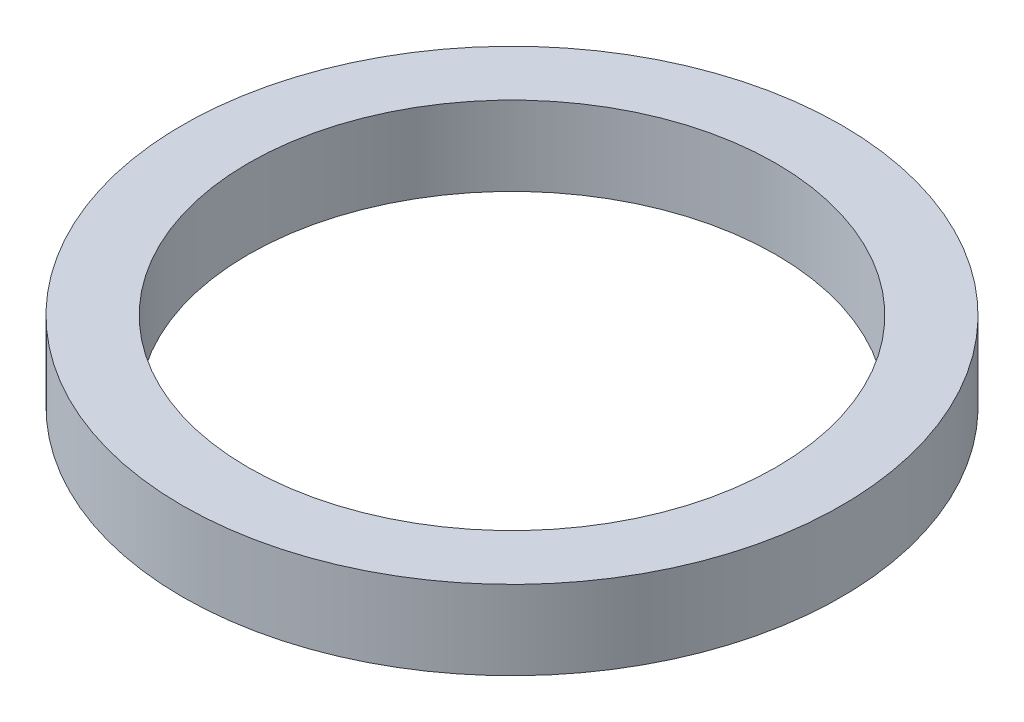
ISO-10303-21;
HEADER;
FILE_DESCRIPTION(('STEP AP214'),'2;1');
FILE_NAME('part.step','',(''),(''),'','','');
FILE_SCHEMA(('AUTOMOTIVE_DESIGN { 1 0 10303 214 1 1 1 1 }'));
ENDSEC;
DATA;
#1=APPLICATION_CONTEXT('core data for automotive mechanical design processes');
#2=APPLICATION_PROTOCOL_DEFINITION('international standard','automotive_design',2000,#1);
#3=PRODUCT_CONTEXT('',#1,'mechanical');
#4=PRODUCT('Part','Part','',(#3));
#5=PRODUCT_RELATED_PRODUCT_CATEGORY('part','',(#4));
#6=PRODUCT_DEFINITION_FORMATION('','',#4);
#7=PRODUCT_DEFINITION_CONTEXT('part definition',#1,'design');
#8=PRODUCT_DEFINITION('design','',#6,#7);
#9=PRODUCT_DEFINITION_SHAPE('','',#8);
#10=(LENGTH_UNIT() NAMED_UNIT(*) SI_UNIT(.MILLI.,.METRE.));
#11=(NAMED_UNIT(*) PLANE_ANGLE_UNIT() SI_UNIT($,.RADIAN.));
#12=(NAMED_UNIT(*) SI_UNIT($,.STERADIAN.) SOLID_ANGLE_UNIT());
#13=UNCERTAINTY_MEASURE_WITH_UNIT(LENGTH_MEASURE(1.E-05),#10,'distance_accuracy_value','');
#14=(GEOMETRIC_REPRESENTATION_CONTEXT(3) GLOBAL_UNCERTAINTY_ASSIGNED_CONTEXT((#13)) GLOBAL_UNIT_ASSIGNED_CONTEXT((#10,
#11,#12)) REPRESENTATION_CONTEXT('',''));
#15=CARTESIAN_POINT('',(0.,0.,0.));
#16=DIRECTION('',(0.,0.,1.));
#17=DIRECTION('',(1.,0.,0.));
#18=AXIS2_PLACEMENT_3D('',#15,#16,#17);
#19=CARTESIAN_POINT('',(0.,6.,0.));
#20=DIRECTION('',(0.,1.,0.));
#21=DIRECTION('',(0.,0.,1.));
#22=AXIS2_PLACEMENT_3D('',#19,#20,#21);
#23=PLANE('',#22);
#24=CARTESIAN_POINT('',(0.,6.,0.));
#25=DIRECTION('',(0.,1.,0.));
#26=DIRECTION('',(0.,0.,1.));
#27=AXIS2_PLACEMENT_3D('',#24,#25,#26);
#28=CIRCLE('',#27,25.);
#29=CARTESIAN_POINT('',(0.,6.,25.));
#30=VERTEX_POINT('',#29);
#31=EDGE_CURVE('E10',#30,#30,#28,.T.);
#32=ORIENTED_EDGE('',*,*,#31,.T.);
#33=EDGE_LOOP('',(#32));
#34=FACE_BOUND('',#33,.T.);
#35=CARTESIAN_POINT('',(0.,6.,0.));
#36=DIRECTION('',(0.,1.,0.));
#37=DIRECTION('',(0.,0.,1.));
#38=AXIS2_PLACEMENT_3D('',#35,#36,#37);
#39=CIRCLE('',#38,20.);
#40=CARTESIAN_POINT('',(0.,6.,20.));
#41=VERTEX_POINT('',#40);
#42=EDGE_CURVE('E50',#41,#41,#39,.T.);
#43=ORIENTED_EDGE('',*,*,#42,.F.);
#44=EDGE_LOOP('',(#43));
#45=FACE_BOUND('',#44,.T.);
#46=ADVANCED_FACE('F37',(#34,#45),#23,.T.);
#47=CARTESIAN_POINT('',(0.,0.,0.));
#48=DIRECTION('',(0.,1.,0.));
#49=DIRECTION('',(0.,0.,1.));
#50=AXIS2_PLACEMENT_3D('',#47,#48,#49);
#51=PLANE('',#50);
#52=CARTESIAN_POINT('',(0.,0.,0.));
#53=DIRECTION('',(0.,1.,0.));
#54=DIRECTION('',(0.,0.,1.));
#55=AXIS2_PLACEMENT_3D('',#52,#53,#54);
#56=CIRCLE('',#55,25.);
#57=CARTESIAN_POINT('',(0.,0.,25.));
#58=VERTEX_POINT('',#57);
#59=EDGE_CURVE('E41',#58,#58,#56,.T.);
#60=ORIENTED_EDGE('',*,*,#59,.F.);
#61=EDGE_LOOP('',(#60));
#62=FACE_BOUND('',#61,.T.);
#63=CARTESIAN_POINT('',(0.,0.,0.));
#64=DIRECTION('',(0.,1.,0.));
#65=DIRECTION('',(0.,0.,1.));
#66=AXIS2_PLACEMENT_3D('',#63,#64,#65);
#67=CIRCLE('',#66,20.);
#68=CARTESIAN_POINT('',(0.,0.,20.));
#69=VERTEX_POINT('',#68);
#70=EDGE_CURVE('E52',#69,#69,#67,.T.);
#71=ORIENTED_EDGE('',*,*,#70,.T.);
#72=EDGE_LOOP('',(#71));
#73=FACE_BOUND('',#72,.T.);
#74=ADVANCED_FACE('F64',(#62,#73),#51,.F.);
#75=CARTESIAN_POINT('',(0.,6.,0.));
#76=DIRECTION('',(0.,-1.,0.));
#77=DIRECTION('',(0.,0.,-1.));
#78=AXIS2_PLACEMENT_3D('',#75,#76,#77);
#79=CYLINDRICAL_SURFACE('',#78,25.);
#80=ORIENTED_EDGE('',*,*,#31,.F.);
#81=EDGE_LOOP('',(#80));
#82=FACE_BOUND('',#81,.T.);
#83=ORIENTED_EDGE('',*,*,#59,.T.);
#84=EDGE_LOOP('',(#83));
#85=FACE_BOUND('',#84,.T.);
#86=ADVANCED_FACE('F39',(#82,#85),#79,.T.);
#87=CARTESIAN_POINT('',(0.,6.,0.));
#88=DIRECTION('',(0.,-1.,0.));
#89=DIRECTION('',(0.,0.,-1.));
#90=AXIS2_PLACEMENT_3D('',#87,#88,#89);
#91=CYLINDRICAL_SURFACE('',#90,20.);
#92=ORIENTED_EDGE('',*,*,#42,.T.);
#93=EDGE_LOOP('',(#92));
#94=FACE_BOUND('',#93,.T.);
#95=ORIENTED_EDGE('',*,*,#70,.F.);
#96=EDGE_LOOP('',(#95));
#97=FACE_BOUND('',#96,.T.);
#98=ADVANCED_FACE('F60',(#94,#97),#91,.F.);
#99=CLOSED_SHELL('',(#46,#74,#86,#98));
#100=MANIFOLD_SOLID_BREP('B2',#99);
#101=ADVANCED_BREP_SHAPE_REPRESENTATION('',(#18,#100),#14);
#102=SHAPE_DEFINITION_REPRESENTATION(#9,#101);
ENDSEC;
END-ISO-10303-21;
